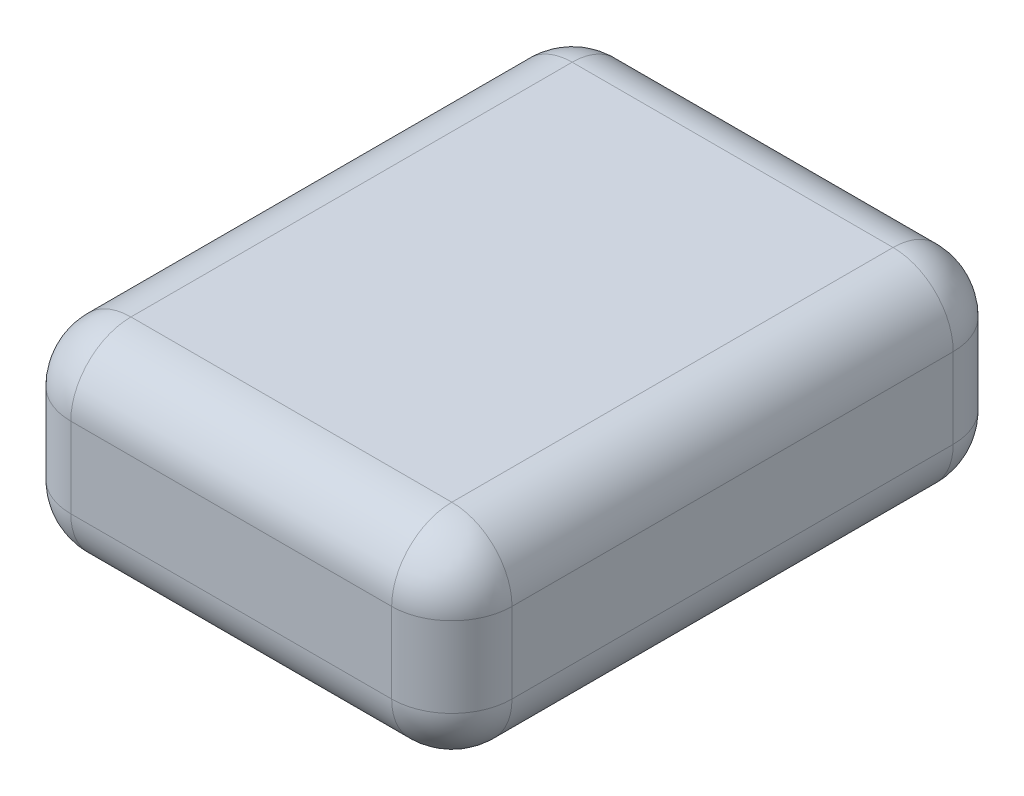
ISO-10303-21;
HEADER;
FILE_DESCRIPTION(('STEP AP214'),'2;1');
FILE_NAME('part.step','',(''),(''),'','','');
FILE_SCHEMA(('AUTOMOTIVE_DESIGN { 1 0 10303 214 1 1 1 1 }'));
ENDSEC;
DATA;
#1=APPLICATION_CONTEXT('core data for automotive mechanical design processes');
#2=APPLICATION_PROTOCOL_DEFINITION('international standard','automotive_design',2000,#1);
#3=PRODUCT_CONTEXT('',#1,'mechanical');
#4=PRODUCT('Part','Part','',(#3));
#5=PRODUCT_RELATED_PRODUCT_CATEGORY('part','',(#4));
#6=PRODUCT_DEFINITION_FORMATION('','',#4);
#7=PRODUCT_DEFINITION_CONTEXT('part definition',#1,'design');
#8=PRODUCT_DEFINITION('design','',#6,#7);
#9=PRODUCT_DEFINITION_SHAPE('','',#8);
#10=(LENGTH_UNIT() NAMED_UNIT(*) SI_UNIT(.MILLI.,.METRE.));
#11=(NAMED_UNIT(*) PLANE_ANGLE_UNIT() SI_UNIT($,.RADIAN.));
#12=(NAMED_UNIT(*) SI_UNIT($,.STERADIAN.) SOLID_ANGLE_UNIT());
#13=UNCERTAINTY_MEASURE_WITH_UNIT(LENGTH_MEASURE(1.E-05),#10,'distance_accuracy_value','');
#14=(GEOMETRIC_REPRESENTATION_CONTEXT(3) GLOBAL_UNCERTAINTY_ASSIGNED_CONTEXT((#13)) GLOBAL_UNIT_ASSIGNED_CONTEXT((#10,
#11,#12)) REPRESENTATION_CONTEXT('',''));
#15=CARTESIAN_POINT('',(0.,0.,0.));
#16=DIRECTION('',(0.,0.,1.));
#17=DIRECTION('',(1.,0.,0.));
#18=AXIS2_PLACEMENT_3D('',#15,#16,#17);
#19=CARTESIAN_POINT('',(11.,10.,-14.));
#20=DIRECTION('',(-1.,0.,0.));
#21=DIRECTION('',(0.,0.,1.));
#22=AXIS2_PLACEMENT_3D('',#19,#20,#21);
#23=PLANE('',#22);
#24=DIRECTION('',(0.,0.,-1.));
#25=VECTOR('',#24,1.);
#26=CARTESIAN_POINT('',(11.,7.,14.));
#27=LINE('',#26,#25);
#28=CARTESIAN_POINT('',(11.,7.,-11.));
#29=VERTEX_POINT('',#28);
#30=CARTESIAN_POINT('',(11.,7.,11.));
#31=VERTEX_POINT('',#30);
#32=EDGE_CURVE('E236',#29,#31,#27,.F.);
#33=ORIENTED_EDGE('',*,*,#32,.T.);
#34=DIRECTION('',(0.,-1.,0.));
#35=VECTOR('',#34,1.);
#36=CARTESIAN_POINT('',(11.,10.,11.));
#37=LINE('',#36,#35);
#38=CARTESIAN_POINT('',(11.,3.,11.));
#39=VERTEX_POINT('',#38);
#40=EDGE_CURVE('E162',#31,#39,#37,.T.);
#41=ORIENTED_EDGE('',*,*,#40,.T.);
#42=DIRECTION('',(0.,0.,-1.));
#43=VECTOR('',#42,1.);
#44=CARTESIAN_POINT('',(11.,3.,-14.));
#45=LINE('',#44,#43);
#46=CARTESIAN_POINT('',(11.,3.,-11.));
#47=VERTEX_POINT('',#46);
#48=EDGE_CURVE('E240',#39,#47,#45,.T.);
#49=ORIENTED_EDGE('',*,*,#48,.T.);
#50=DIRECTION('',(0.,-1.,0.));
#51=VECTOR('',#50,1.);
#52=CARTESIAN_POINT('',(11.,10.,-11.));
#53=LINE('',#52,#51);
#54=EDGE_CURVE('E238',#47,#29,#53,.F.);
#55=ORIENTED_EDGE('',*,*,#54,.T.);
#56=EDGE_LOOP('',(#33,#41,#49,#55));
#57=FACE_BOUND('',#56,.T.);
#58=ADVANCED_FACE('F41',(#57),#23,.F.);
#59=CARTESIAN_POINT('',(-11.,10.,-14.));
#60=DIRECTION('',(0.,0.,1.));
#61=DIRECTION('',(1.,0.,0.));
#62=AXIS2_PLACEMENT_3D('',#59,#60,#61);
#63=PLANE('',#62);
#64=DIRECTION('',(-1.,0.,0.));
#65=VECTOR('',#64,1.);
#66=CARTESIAN_POINT('',(11.,7.,-14.));
#67=LINE('',#66,#65);
#68=CARTESIAN_POINT('',(-8.00000000000001,7.,-14.));
#69=VERTEX_POINT('',#68);
#70=CARTESIAN_POINT('',(7.99999999999999,7.,-14.));
#71=VERTEX_POINT('',#70);
#72=EDGE_CURVE('E243',#69,#71,#67,.F.);
#73=ORIENTED_EDGE('',*,*,#72,.T.);
#74=DIRECTION('',(0.,-1.,0.));
#75=VECTOR('',#74,1.);
#76=CARTESIAN_POINT('',(7.99999999999999,10.,-14.));
#77=LINE('',#76,#75);
#78=CARTESIAN_POINT('',(7.99999999999999,3.,-14.));
#79=VERTEX_POINT('',#78);
#80=EDGE_CURVE('E248',#71,#79,#77,.T.);
#81=ORIENTED_EDGE('',*,*,#80,.T.);
#82=DIRECTION('',(-1.,0.,0.));
#83=VECTOR('',#82,1.);
#84=CARTESIAN_POINT('',(-11.,3.,-14.));
#85=LINE('',#84,#83);
#86=CARTESIAN_POINT('',(-8.00000000000001,3.,-14.));
#87=VERTEX_POINT('',#86);
#88=EDGE_CURVE('E246',#79,#87,#85,.T.);
#89=ORIENTED_EDGE('',*,*,#88,.T.);
#90=DIRECTION('',(0.,-1.,0.));
#91=VECTOR('',#90,1.);
#92=CARTESIAN_POINT('',(-8.00000000000001,10.,-14.));
#93=LINE('',#92,#91);
#94=EDGE_CURVE('E220',#87,#69,#93,.F.);
#95=ORIENTED_EDGE('',*,*,#94,.T.);
#96=EDGE_LOOP('',(#73,#81,#89,#95));
#97=FACE_BOUND('',#96,.T.);
#98=ADVANCED_FACE('F312',(#97),#63,.F.);
#99=CARTESIAN_POINT('',(-11.,10.,-14.));
#100=DIRECTION('',(1.,0.,0.));
#101=DIRECTION('',(0.,0.,-1.));
#102=AXIS2_PLACEMENT_3D('',#99,#100,#101);
#103=PLANE('',#102);
#104=DIRECTION('',(0.,-1.,0.));
#105=VECTOR('',#104,1.);
#106=CARTESIAN_POINT('',(-11.,10.,-11.));
#107=LINE('',#106,#105);
#108=CARTESIAN_POINT('',(-11.,7.,-11.));
#109=VERTEX_POINT('',#108);
#110=CARTESIAN_POINT('',(-11.,3.,-11.));
#111=VERTEX_POINT('',#110);
#112=EDGE_CURVE('E222',#109,#111,#107,.T.);
#113=ORIENTED_EDGE('',*,*,#112,.T.);
#114=DIRECTION('',(0.,0.,1.));
#115=VECTOR('',#114,1.);
#116=CARTESIAN_POINT('',(-11.,3.,-14.));
#117=LINE('',#116,#115);
#118=CARTESIAN_POINT('',(-11.,3.,11.));
#119=VERTEX_POINT('',#118);
#120=EDGE_CURVE('E229',#111,#119,#117,.T.);
#121=ORIENTED_EDGE('',*,*,#120,.T.);
#122=DIRECTION('',(0.,-1.,0.));
#123=VECTOR('',#122,1.);
#124=CARTESIAN_POINT('',(-11.,10.,11.));
#125=LINE('',#124,#123);
#126=CARTESIAN_POINT('',(-11.,7.,11.));
#127=VERTEX_POINT('',#126);
#128=EDGE_CURVE('E225',#119,#127,#125,.F.);
#129=ORIENTED_EDGE('',*,*,#128,.T.);
#130=DIRECTION('',(0.,0.,1.));
#131=VECTOR('',#130,1.);
#132=CARTESIAN_POINT('',(-11.,7.,-14.));
#133=LINE('',#132,#131);
#134=EDGE_CURVE('E226',#127,#109,#133,.F.);
#135=ORIENTED_EDGE('',*,*,#134,.T.);
#136=EDGE_LOOP('',(#113,#121,#129,#135));
#137=FACE_BOUND('',#136,.T.);
#138=ADVANCED_FACE('F298',(#137),#103,.F.);
#139=CARTESIAN_POINT('',(-11.,10.,14.));
#140=DIRECTION('',(0.,0.,-1.));
#141=DIRECTION('',(-1.,0.,0.));
#142=AXIS2_PLACEMENT_3D('',#139,#140,#141);
#143=PLANE('',#142);
#144=DIRECTION('',(0.,-1.,0.));
#145=VECTOR('',#144,1.);
#146=CARTESIAN_POINT('',(-8.,10.,14.));
#147=LINE('',#146,#145);
#148=CARTESIAN_POINT('',(-8.,7.,14.));
#149=VERTEX_POINT('',#148);
#150=CARTESIAN_POINT('',(-8.,3.,14.));
#151=VERTEX_POINT('',#150);
#152=EDGE_CURVE('E140',#149,#151,#147,.T.);
#153=ORIENTED_EDGE('',*,*,#152,.T.);
#154=DIRECTION('',(1.,0.,0.));
#155=VECTOR('',#154,1.);
#156=CARTESIAN_POINT('',(-11.,3.,14.));
#157=LINE('',#156,#155);
#158=CARTESIAN_POINT('',(8.,3.,14.));
#159=VERTEX_POINT('',#158);
#160=EDGE_CURVE('E136',#151,#159,#157,.T.);
#161=ORIENTED_EDGE('',*,*,#160,.T.);
#162=DIRECTION('',(0.,-1.,0.));
#163=VECTOR('',#162,1.);
#164=CARTESIAN_POINT('',(8.,10.,14.));
#165=LINE('',#164,#163);
#166=CARTESIAN_POINT('',(8.,7.,14.));
#167=VERTEX_POINT('',#166);
#168=EDGE_CURVE('E130',#159,#167,#165,.F.);
#169=ORIENTED_EDGE('',*,*,#168,.T.);
#170=DIRECTION('',(1.,0.,0.));
#171=VECTOR('',#170,1.);
#172=CARTESIAN_POINT('',(-11.,7.,14.));
#173=LINE('',#172,#171);
#174=EDGE_CURVE('E133',#167,#149,#173,.F.);
#175=ORIENTED_EDGE('',*,*,#174,.T.);
#176=EDGE_LOOP('',(#153,#161,#169,#175));
#177=FACE_BOUND('',#176,.T.);
#178=ADVANCED_FACE('F132',(#177),#143,.F.);
#179=CARTESIAN_POINT('',(0.,10.,0.));
#180=DIRECTION('',(0.,1.,0.));
#181=DIRECTION('',(0.,0.,1.));
#182=AXIS2_PLACEMENT_3D('',#179,#180,#181);
#183=PLANE('',#182);
#184=DIRECTION('',(0.,0.,-1.));
#185=VECTOR('',#184,1.);
#186=CARTESIAN_POINT('',(7.99999999999999,10.,-14.));
#187=LINE('',#186,#185);
#188=CARTESIAN_POINT('',(8.,10.,11.));
#189=VERTEX_POINT('',#188);
#190=CARTESIAN_POINT('',(7.99999999999999,10.,-11.));
#191=VERTEX_POINT('',#190);
#192=EDGE_CURVE('E251',#189,#191,#187,.T.);
#193=ORIENTED_EDGE('',*,*,#192,.T.);
#194=DIRECTION('',(-1.,0.,0.));
#195=VECTOR('',#194,1.);
#196=CARTESIAN_POINT('',(-11.,10.,-11.));
#197=LINE('',#196,#195);
#198=CARTESIAN_POINT('',(-8.00000000000001,10.,-11.));
#199=VERTEX_POINT('',#198);
#200=EDGE_CURVE('E11',#191,#199,#197,.T.);
#201=ORIENTED_EDGE('',*,*,#200,.T.);
#202=DIRECTION('',(0.,0.,1.));
#203=VECTOR('',#202,1.);
#204=CARTESIAN_POINT('',(-8.,10.,14.));
#205=LINE('',#204,#203);
#206=CARTESIAN_POINT('',(-8.,10.,11.));
#207=VERTEX_POINT('',#206);
#208=EDGE_CURVE('E50',#199,#207,#205,.T.);
#209=ORIENTED_EDGE('',*,*,#208,.T.);
#210=DIRECTION('',(1.,0.,0.));
#211=VECTOR('',#210,1.);
#212=CARTESIAN_POINT('',(11.,10.,11.));
#213=LINE('',#212,#211);
#214=EDGE_CURVE('E253',#207,#189,#213,.T.);
#215=ORIENTED_EDGE('',*,*,#214,.T.);
#216=EDGE_LOOP('',(#193,#201,#209,#215));
#217=FACE_BOUND('',#216,.T.);
#218=ADVANCED_FACE('F373',(#217),#183,.T.);
#219=CARTESIAN_POINT('',(0.,0.,0.));
#220=DIRECTION('',(0.,1.,0.));
#221=DIRECTION('',(0.,0.,1.));
#222=AXIS2_PLACEMENT_3D('',#219,#220,#221);
#223=PLANE('',#222);
#224=DIRECTION('',(0.,0.,-1.));
#225=VECTOR('',#224,1.);
#226=CARTESIAN_POINT('',(7.99999999999999,0.,0.));
#227=LINE('',#226,#225);
#228=CARTESIAN_POINT('',(7.99999999999999,0.,-11.));
#229=VERTEX_POINT('',#228);
#230=CARTESIAN_POINT('',(8.,0.,11.));
#231=VERTEX_POINT('',#230);
#232=EDGE_CURVE('E286',#229,#231,#227,.F.);
#233=ORIENTED_EDGE('',*,*,#232,.T.);
#234=DIRECTION('',(1.,0.,0.));
#235=VECTOR('',#234,1.);
#236=CARTESIAN_POINT('',(0.,0.,11.));
#237=LINE('',#236,#235);
#238=CARTESIAN_POINT('',(-8.,0.,11.));
#239=VERTEX_POINT('',#238);
#240=EDGE_CURVE('E231',#231,#239,#237,.F.);
#241=ORIENTED_EDGE('',*,*,#240,.T.);
#242=DIRECTION('',(0.,0.,1.));
#243=VECTOR('',#242,1.);
#244=CARTESIAN_POINT('',(-8.00000000000001,0.,0.));
#245=LINE('',#244,#243);
#246=CARTESIAN_POINT('',(-8.00000000000001,0.,-11.));
#247=VERTEX_POINT('',#246);
#248=EDGE_CURVE('E276',#239,#247,#245,.F.);
#249=ORIENTED_EDGE('',*,*,#248,.T.);
#250=DIRECTION('',(-1.,0.,0.));
#251=VECTOR('',#250,1.);
#252=CARTESIAN_POINT('',(0.,0.,-11.));
#253=LINE('',#252,#251);
#254=EDGE_CURVE('E281',#247,#229,#253,.F.);
#255=ORIENTED_EDGE('',*,*,#254,.T.);
#256=EDGE_LOOP('',(#233,#241,#249,#255));
#257=FACE_BOUND('',#256,.T.);
#258=ADVANCED_FACE('F284',(#257),#223,.F.);
#259=CARTESIAN_POINT('',(0.,7.,-11.));
#260=DIRECTION('',(1.,0.,0.));
#261=DIRECTION('',(0.,0.,-1.));
#262=AXIS2_PLACEMENT_3D('',#259,#260,#261);
#263=CYLINDRICAL_SURFACE('',#262,3.);
#264=CARTESIAN_POINT('',(-8.00000000000001,7.,-11.));
#265=DIRECTION('',(-1.,0.,0.));
#266=DIRECTION('',(0.,0.,1.));
#267=AXIS2_PLACEMENT_3D('',#264,#265,#266);
#268=CIRCLE('',#267,3.);
#269=EDGE_CURVE('E45',#199,#69,#268,.T.);
#270=ORIENTED_EDGE('',*,*,#269,.F.);
#271=ORIENTED_EDGE('',*,*,#200,.F.);
#272=CARTESIAN_POINT('',(7.99999999999999,7.,-11.));
#273=DIRECTION('',(1.,0.,0.));
#274=DIRECTION('',(0.,0.,-1.));
#275=AXIS2_PLACEMENT_3D('',#272,#273,#274);
#276=CIRCLE('',#275,3.);
#277=EDGE_CURVE('E201',#71,#191,#276,.T.);
#278=ORIENTED_EDGE('',*,*,#277,.F.);
#279=ORIENTED_EDGE('',*,*,#72,.F.);
#280=EDGE_LOOP('',(#270,#271,#278,#279));
#281=FACE_BOUND('',#280,.T.);
#282=ADVANCED_FACE('F43',(#281),#263,.T.);
#283=CARTESIAN_POINT('',(-8.00000000000001,7.,-11.));
#284=DIRECTION('',(0.,0.,-1.));
#285=DIRECTION('',(-1.,0.,0.));
#286=AXIS2_PLACEMENT_3D('',#283,#284,#285);
#287=SPHERICAL_SURFACE('',#286,3.);
#288=CARTESIAN_POINT('',(-8.00000000000001,7.,-11.));
#289=DIRECTION('',(0.,0.,-1.));
#290=DIRECTION('',(-1.,0.,0.));
#291=AXIS2_PLACEMENT_3D('',#288,#289,#290);
#292=CIRCLE('',#291,3.);
#293=EDGE_CURVE('E197',#199,#109,#292,.F.);
#294=ORIENTED_EDGE('',*,*,#293,.F.);
#295=ORIENTED_EDGE('',*,*,#269,.T.);
#296=CARTESIAN_POINT('',(-8.00000000000001,7.,-11.));
#297=DIRECTION('',(0.,1.,0.));
#298=DIRECTION('',(0.,0.,1.));
#299=AXIS2_PLACEMENT_3D('',#296,#297,#298);
#300=CIRCLE('',#299,3.);
#301=EDGE_CURVE('E199',#109,#69,#300,.F.);
#302=ORIENTED_EDGE('',*,*,#301,.F.);
#303=EDGE_LOOP('',(#294,#295,#302));
#304=FACE_BOUND('',#303,.T.);
#305=ADVANCED_FACE('F211',(#304),#287,.T.);
#306=CARTESIAN_POINT('',(7.99999999999999,7.,-11.));
#307=DIRECTION('',(0.,1.,0.));
#308=DIRECTION('',(0.,0.,1.));
#309=AXIS2_PLACEMENT_3D('',#306,#307,#308);
#310=SPHERICAL_SURFACE('',#309,3.);
#311=CARTESIAN_POINT('',(7.99999999999999,7.,-11.));
#312=DIRECTION('',(0.,1.,0.));
#313=DIRECTION('',(0.,0.,1.));
#314=AXIS2_PLACEMENT_3D('',#311,#312,#313);
#315=CIRCLE('',#314,3.);
#316=EDGE_CURVE('E191',#71,#29,#315,.F.);
#317=ORIENTED_EDGE('',*,*,#316,.F.);
#318=ORIENTED_EDGE('',*,*,#277,.T.);
#319=CARTESIAN_POINT('',(7.99999999999999,7.,-11.));
#320=DIRECTION('',(0.,0.,-1.));
#321=DIRECTION('',(-1.,0.,0.));
#322=AXIS2_PLACEMENT_3D('',#319,#320,#321);
#323=CIRCLE('',#322,3.);
#324=EDGE_CURVE('E194',#29,#191,#323,.F.);
#325=ORIENTED_EDGE('',*,*,#324,.F.);
#326=EDGE_LOOP('',(#317,#318,#325));
#327=FACE_BOUND('',#326,.T.);
#328=ADVANCED_FACE('F309',(#327),#310,.T.);
#329=CARTESIAN_POINT('',(-8.00000000000001,10.,-11.));
#330=DIRECTION('',(0.,-1.,0.));
#331=DIRECTION('',(0.,0.,-1.));
#332=AXIS2_PLACEMENT_3D('',#329,#330,#331);
#333=CYLINDRICAL_SURFACE('',#332,3.);
#334=ORIENTED_EDGE('',*,*,#301,.T.);
#335=ORIENTED_EDGE('',*,*,#94,.F.);
#336=CARTESIAN_POINT('',(-8.00000000000001,3.,-11.));
#337=DIRECTION('',(0.,-1.,0.));
#338=DIRECTION('',(0.,0.,-1.));
#339=AXIS2_PLACEMENT_3D('',#336,#337,#338);
#340=CIRCLE('',#339,3.);
#341=EDGE_CURVE('E185',#111,#87,#340,.T.);
#342=ORIENTED_EDGE('',*,*,#341,.F.);
#343=ORIENTED_EDGE('',*,*,#112,.F.);
#344=EDGE_LOOP('',(#334,#335,#342,#343));
#345=FACE_BOUND('',#344,.T.);
#346=ADVANCED_FACE('F218',(#345),#333,.T.);
#347=CARTESIAN_POINT('',(-8.00000000000001,7.,0.));
#348=DIRECTION('',(0.,0.,-1.));
#349=DIRECTION('',(-1.,0.,0.));
#350=AXIS2_PLACEMENT_3D('',#347,#348,#349);
#351=CYLINDRICAL_SURFACE('',#350,3.);
#352=ORIENTED_EDGE('',*,*,#293,.T.);
#353=ORIENTED_EDGE('',*,*,#134,.F.);
#354=CARTESIAN_POINT('',(-8.,7.,11.));
#355=DIRECTION('',(0.,0.,1.));
#356=DIRECTION('',(1.,0.,0.));
#357=AXIS2_PLACEMENT_3D('',#354,#355,#356);
#358=CIRCLE('',#357,3.);
#359=EDGE_CURVE('E182',#207,#127,#358,.T.);
#360=ORIENTED_EDGE('',*,*,#359,.F.);
#361=ORIENTED_EDGE('',*,*,#208,.F.);
#362=EDGE_LOOP('',(#352,#353,#360,#361));
#363=FACE_BOUND('',#362,.T.);
#364=ADVANCED_FACE('F300',(#363),#351,.T.);
#365=CARTESIAN_POINT('',(0.,7.,11.));
#366=DIRECTION('',(-1.,0.,0.));
#367=DIRECTION('',(0.,0.,1.));
#368=AXIS2_PLACEMENT_3D('',#365,#366,#367);
#369=CYLINDRICAL_SURFACE('',#368,3.);
#370=CARTESIAN_POINT('',(8.,7.,11.));
#371=DIRECTION('',(1.,0.,0.));
#372=DIRECTION('',(0.,0.,-1.));
#373=AXIS2_PLACEMENT_3D('',#370,#371,#372);
#374=CIRCLE('',#373,3.);
#375=EDGE_CURVE('E146',#189,#167,#374,.T.);
#376=ORIENTED_EDGE('',*,*,#375,.F.);
#377=ORIENTED_EDGE('',*,*,#214,.F.);
#378=CARTESIAN_POINT('',(-8.,7.,11.));
#379=DIRECTION('',(-1.,0.,0.));
#380=DIRECTION('',(0.,0.,1.));
#381=AXIS2_PLACEMENT_3D('',#378,#379,#380);
#382=CIRCLE('',#381,3.);
#383=EDGE_CURVE('E149',#149,#207,#382,.T.);
#384=ORIENTED_EDGE('',*,*,#383,.F.);
#385=ORIENTED_EDGE('',*,*,#174,.F.);
#386=EDGE_LOOP('',(#376,#377,#384,#385));
#387=FACE_BOUND('',#386,.T.);
#388=ADVANCED_FACE('F145',(#387),#369,.T.);
#389=CARTESIAN_POINT('',(7.99999999999999,7.,0.));
#390=DIRECTION('',(0.,0.,1.));
#391=DIRECTION('',(1.,0.,0.));
#392=AXIS2_PLACEMENT_3D('',#389,#390,#391);
#393=CYLINDRICAL_SURFACE('',#392,3.);
#394=ORIENTED_EDGE('',*,*,#324,.T.);
#395=ORIENTED_EDGE('',*,*,#192,.F.);
#396=CARTESIAN_POINT('',(8.,7.,11.));
#397=DIRECTION('',(0.,0.,1.));
#398=DIRECTION('',(1.,0.,0.));
#399=AXIS2_PLACEMENT_3D('',#396,#397,#398);
#400=CIRCLE('',#399,3.);
#401=EDGE_CURVE('E158',#31,#189,#400,.T.);
#402=ORIENTED_EDGE('',*,*,#401,.F.);
#403=ORIENTED_EDGE('',*,*,#32,.F.);
#404=EDGE_LOOP('',(#394,#395,#402,#403));
#405=FACE_BOUND('',#404,.T.);
#406=ADVANCED_FACE('F307',(#405),#393,.T.);
#407=CARTESIAN_POINT('',(7.99999999999999,10.,-11.));
#408=DIRECTION('',(0.,-1.,0.));
#409=DIRECTION('',(0.,0.,-1.));
#410=AXIS2_PLACEMENT_3D('',#407,#408,#409);
#411=CYLINDRICAL_SURFACE('',#410,3.);
#412=ORIENTED_EDGE('',*,*,#316,.T.);
#413=ORIENTED_EDGE('',*,*,#54,.F.);
#414=CARTESIAN_POINT('',(7.99999999999999,3.,-11.));
#415=DIRECTION('',(0.,-1.,0.));
#416=DIRECTION('',(0.,0.,-1.));
#417=AXIS2_PLACEMENT_3D('',#414,#415,#416);
#418=CIRCLE('',#417,3.);
#419=EDGE_CURVE('E177',#79,#47,#418,.T.);
#420=ORIENTED_EDGE('',*,*,#419,.F.);
#421=ORIENTED_EDGE('',*,*,#80,.F.);
#422=EDGE_LOOP('',(#412,#413,#420,#421));
#423=FACE_BOUND('',#422,.T.);
#424=ADVANCED_FACE('F358',(#423),#411,.T.);
#425=CARTESIAN_POINT('',(-11.,3.,-11.));
#426=DIRECTION('',(-1.,0.,0.));
#427=DIRECTION('',(0.,0.,1.));
#428=AXIS2_PLACEMENT_3D('',#425,#426,#427);
#429=CYLINDRICAL_SURFACE('',#428,3.);
#430=CARTESIAN_POINT('',(-8.00000000000001,3.,-11.));
#431=DIRECTION('',(-1.,0.,0.));
#432=DIRECTION('',(0.,0.,1.));
#433=AXIS2_PLACEMENT_3D('',#430,#431,#432);
#434=CIRCLE('',#433,3.);
#435=EDGE_CURVE('E188',#87,#247,#434,.T.);
#436=ORIENTED_EDGE('',*,*,#435,.F.);
#437=ORIENTED_EDGE('',*,*,#88,.F.);
#438=CARTESIAN_POINT('',(7.99999999999999,3.,-11.));
#439=DIRECTION('',(1.,0.,0.));
#440=DIRECTION('',(0.,0.,-1.));
#441=AXIS2_PLACEMENT_3D('',#438,#439,#440);
#442=CIRCLE('',#441,3.);
#443=EDGE_CURVE('E175',#229,#79,#442,.T.);
#444=ORIENTED_EDGE('',*,*,#443,.F.);
#445=ORIENTED_EDGE('',*,*,#254,.F.);
#446=EDGE_LOOP('',(#436,#437,#444,#445));
#447=FACE_BOUND('',#446,.T.);
#448=ADVANCED_FACE('F354',(#447),#429,.T.);
#449=CARTESIAN_POINT('',(-8.00000000000001,3.,-11.));
#450=DIRECTION('',(0.,0.,-1.));
#451=DIRECTION('',(-1.,0.,0.));
#452=AXIS2_PLACEMENT_3D('',#449,#450,#451);
#453=SPHERICAL_SURFACE('',#452,3.);
#454=ORIENTED_EDGE('',*,*,#341,.T.);
#455=ORIENTED_EDGE('',*,*,#435,.T.);
#456=CARTESIAN_POINT('',(-8.00000000000001,3.,-11.));
#457=DIRECTION('',(0.,0.,-1.));
#458=DIRECTION('',(-1.,0.,0.));
#459=AXIS2_PLACEMENT_3D('',#456,#457,#458);
#460=CIRCLE('',#459,3.);
#461=EDGE_CURVE('E166',#111,#247,#460,.F.);
#462=ORIENTED_EDGE('',*,*,#461,.F.);
#463=EDGE_LOOP('',(#454,#455,#462));
#464=FACE_BOUND('',#463,.T.);
#465=ADVANCED_FACE('F350',(#464),#453,.T.);
#466=CARTESIAN_POINT('',(-8.,7.,11.));
#467=DIRECTION('',(0.,1.,0.));
#468=DIRECTION('',(0.,0.,1.));
#469=AXIS2_PLACEMENT_3D('',#466,#467,#468);
#470=SPHERICAL_SURFACE('',#469,3.);
#471=ORIENTED_EDGE('',*,*,#383,.T.);
#472=ORIENTED_EDGE('',*,*,#359,.T.);
#473=CARTESIAN_POINT('',(-8.,7.,11.));
#474=DIRECTION('',(0.,1.,0.));
#475=DIRECTION('',(0.,0.,1.));
#476=AXIS2_PLACEMENT_3D('',#473,#474,#475);
#477=CIRCLE('',#476,3.);
#478=EDGE_CURVE('E163',#149,#127,#477,.F.);
#479=ORIENTED_EDGE('',*,*,#478,.F.);
#480=EDGE_LOOP('',(#471,#472,#479));
#481=FACE_BOUND('',#480,.T.);
#482=ADVANCED_FACE('F347',(#481),#470,.T.);
#483=CARTESIAN_POINT('',(8.,7.,11.));
#484=DIRECTION('',(0.,1.,0.));
#485=DIRECTION('',(0.,0.,1.));
#486=AXIS2_PLACEMENT_3D('',#483,#484,#485);
#487=SPHERICAL_SURFACE('',#486,3.);
#488=ORIENTED_EDGE('',*,*,#401,.T.);
#489=ORIENTED_EDGE('',*,*,#375,.T.);
#490=CARTESIAN_POINT('',(8.,7.,11.));
#491=DIRECTION('',(0.,1.,0.));
#492=DIRECTION('',(0.,0.,1.));
#493=AXIS2_PLACEMENT_3D('',#490,#491,#492);
#494=CIRCLE('',#493,3.);
#495=EDGE_CURVE('E155',#31,#167,#494,.F.);
#496=ORIENTED_EDGE('',*,*,#495,.F.);
#497=EDGE_LOOP('',(#488,#489,#496));
#498=FACE_BOUND('',#497,.T.);
#499=ADVANCED_FACE('F154',(#498),#487,.T.);
#500=CARTESIAN_POINT('',(7.99999999999999,3.,-11.));
#501=DIRECTION('',(0.,0.,-1.));
#502=DIRECTION('',(-1.,0.,0.));
#503=AXIS2_PLACEMENT_3D('',#500,#501,#502);
#504=SPHERICAL_SURFACE('',#503,3.);
#505=ORIENTED_EDGE('',*,*,#443,.T.);
#506=ORIENTED_EDGE('',*,*,#419,.T.);
#507=CARTESIAN_POINT('',(7.99999999999999,3.,-11.));
#508=DIRECTION('',(0.,0.,-1.));
#509=DIRECTION('',(-1.,0.,0.));
#510=AXIS2_PLACEMENT_3D('',#507,#508,#509);
#511=CIRCLE('',#510,3.);
#512=EDGE_CURVE('E164',#229,#47,#511,.F.);
#513=ORIENTED_EDGE('',*,*,#512,.F.);
#514=EDGE_LOOP('',(#505,#506,#513));
#515=FACE_BOUND('',#514,.T.);
#516=ADVANCED_FACE('F341',(#515),#504,.T.);
#517=CARTESIAN_POINT('',(-8.00000000000001,3.,-14.));
#518=DIRECTION('',(0.,0.,1.));
#519=DIRECTION('',(1.,0.,0.));
#520=AXIS2_PLACEMENT_3D('',#517,#518,#519);
#521=CYLINDRICAL_SURFACE('',#520,3.);
#522=ORIENTED_EDGE('',*,*,#461,.T.);
#523=ORIENTED_EDGE('',*,*,#248,.F.);
#524=CARTESIAN_POINT('',(-8.,3.,11.));
#525=DIRECTION('',(0.,0.,1.));
#526=DIRECTION('',(1.,0.,0.));
#527=AXIS2_PLACEMENT_3D('',#524,#525,#526);
#528=CIRCLE('',#527,3.);
#529=EDGE_CURVE('E169',#119,#239,#528,.T.);
#530=ORIENTED_EDGE('',*,*,#529,.F.);
#531=ORIENTED_EDGE('',*,*,#120,.F.);
#532=EDGE_LOOP('',(#522,#523,#530,#531));
#533=FACE_BOUND('',#532,.T.);
#534=ADVANCED_FACE('F278',(#533),#521,.T.);
#535=CARTESIAN_POINT('',(-8.,10.,11.));
#536=DIRECTION('',(0.,-1.,0.));
#537=DIRECTION('',(0.,0.,-1.));
#538=AXIS2_PLACEMENT_3D('',#535,#536,#537);
#539=CYLINDRICAL_SURFACE('',#538,3.);
#540=ORIENTED_EDGE('',*,*,#478,.T.);
#541=ORIENTED_EDGE('',*,*,#128,.F.);
#542=CARTESIAN_POINT('',(-8.,3.,11.));
#543=DIRECTION('',(0.,-1.,0.));
#544=DIRECTION('',(0.,0.,-1.));
#545=AXIS2_PLACEMENT_3D('',#542,#543,#544);
#546=CIRCLE('',#545,3.);
#547=EDGE_CURVE('E265',#151,#119,#546,.T.);
#548=ORIENTED_EDGE('',*,*,#547,.F.);
#549=ORIENTED_EDGE('',*,*,#152,.F.);
#550=EDGE_LOOP('',(#540,#541,#548,#549));
#551=FACE_BOUND('',#550,.T.);
#552=ADVANCED_FACE('F297',(#551),#539,.T.);
#553=CARTESIAN_POINT('',(8.,10.,11.));
#554=DIRECTION('',(0.,-1.,0.));
#555=DIRECTION('',(0.,0.,-1.));
#556=AXIS2_PLACEMENT_3D('',#553,#554,#555);
#557=CYLINDRICAL_SURFACE('',#556,3.);
#558=ORIENTED_EDGE('',*,*,#495,.T.);
#559=ORIENTED_EDGE('',*,*,#168,.F.);
#560=CARTESIAN_POINT('',(8.,3.,11.));
#561=DIRECTION('',(0.,-1.,0.));
#562=DIRECTION('',(0.,0.,-1.));
#563=AXIS2_PLACEMENT_3D('',#560,#561,#562);
#564=CIRCLE('',#563,3.);
#565=EDGE_CURVE('E262',#39,#159,#564,.T.);
#566=ORIENTED_EDGE('',*,*,#565,.F.);
#567=ORIENTED_EDGE('',*,*,#40,.F.);
#568=EDGE_LOOP('',(#558,#559,#566,#567));
#569=FACE_BOUND('',#568,.T.);
#570=ADVANCED_FACE('F160',(#569),#557,.T.);
#571=CARTESIAN_POINT('',(7.99999999999999,3.,-14.));
#572=DIRECTION('',(0.,0.,-1.));
#573=DIRECTION('',(-1.,0.,0.));
#574=AXIS2_PLACEMENT_3D('',#571,#572,#573);
#575=CYLINDRICAL_SURFACE('',#574,3.);
#576=ORIENTED_EDGE('',*,*,#512,.T.);
#577=ORIENTED_EDGE('',*,*,#48,.F.);
#578=CARTESIAN_POINT('',(8.,3.,11.));
#579=DIRECTION('',(0.,0.,1.));
#580=DIRECTION('',(1.,0.,0.));
#581=AXIS2_PLACEMENT_3D('',#578,#579,#580);
#582=CIRCLE('',#581,3.);
#583=EDGE_CURVE('E260',#231,#39,#582,.T.);
#584=ORIENTED_EDGE('',*,*,#583,.F.);
#585=ORIENTED_EDGE('',*,*,#232,.F.);
#586=EDGE_LOOP('',(#576,#577,#584,#585));
#587=FACE_BOUND('',#586,.T.);
#588=ADVANCED_FACE('F331',(#587),#575,.T.);
#589=CARTESIAN_POINT('',(-8.,3.,11.));
#590=DIRECTION('',(-1.,0.,0.));
#591=DIRECTION('',(0.,0.,1.));
#592=AXIS2_PLACEMENT_3D('',#589,#590,#591);
#593=SPHERICAL_SURFACE('',#592,3.);
#594=ORIENTED_EDGE('',*,*,#547,.T.);
#595=ORIENTED_EDGE('',*,*,#529,.T.);
#596=CARTESIAN_POINT('',(-8.,3.,11.));
#597=DIRECTION('',(-1.,0.,0.));
#598=DIRECTION('',(0.,0.,1.));
#599=AXIS2_PLACEMENT_3D('',#596,#597,#598);
#600=CIRCLE('',#599,3.);
#601=EDGE_CURVE('E258',#151,#239,#600,.F.);
#602=ORIENTED_EDGE('',*,*,#601,.F.);
#603=EDGE_LOOP('',(#594,#595,#602));
#604=FACE_BOUND('',#603,.T.);
#605=ADVANCED_FACE('F272',(#604),#593,.T.);
#606=CARTESIAN_POINT('',(8.,3.,11.));
#607=DIRECTION('',(1.,0.,0.));
#608=DIRECTION('',(0.,0.,-1.));
#609=AXIS2_PLACEMENT_3D('',#606,#607,#608);
#610=SPHERICAL_SURFACE('',#609,3.);
#611=ORIENTED_EDGE('',*,*,#583,.T.);
#612=ORIENTED_EDGE('',*,*,#565,.T.);
#613=CARTESIAN_POINT('',(8.,3.,11.));
#614=DIRECTION('',(1.,0.,0.));
#615=DIRECTION('',(0.,0.,-1.));
#616=AXIS2_PLACEMENT_3D('',#613,#614,#615);
#617=CIRCLE('',#616,3.);
#618=EDGE_CURVE('E256',#231,#159,#617,.F.);
#619=ORIENTED_EDGE('',*,*,#618,.F.);
#620=EDGE_LOOP('',(#611,#612,#619));
#621=FACE_BOUND('',#620,.T.);
#622=ADVANCED_FACE('F325',(#621),#610,.T.);
#623=CARTESIAN_POINT('',(-11.,3.,11.));
#624=DIRECTION('',(1.,0.,0.));
#625=DIRECTION('',(0.,0.,-1.));
#626=AXIS2_PLACEMENT_3D('',#623,#624,#625);
#627=CYLINDRICAL_SURFACE('',#626,3.);
#628=ORIENTED_EDGE('',*,*,#601,.T.);
#629=ORIENTED_EDGE('',*,*,#240,.F.);
#630=ORIENTED_EDGE('',*,*,#618,.T.);
#631=ORIENTED_EDGE('',*,*,#160,.F.);
#632=EDGE_LOOP('',(#628,#629,#630,#631));
#633=FACE_BOUND('',#632,.T.);
#634=ADVANCED_FACE('F322',(#633),#627,.T.);
#635=CLOSED_SHELL('',(#58,#98,#138,#178,#218,#258,#282,#305,#328,#346,#364,#388,#406,#424,#448,
#465,#482,#499,#516,#534,#552,#570,#588,#605,#622,#634));
#636=MANIFOLD_SOLID_BREP('B2',#635);
#637=ADVANCED_BREP_SHAPE_REPRESENTATION('',(#18,#636),#14);
#638=SHAPE_DEFINITION_REPRESENTATION(#9,#637);
ENDSEC;
END-ISO-10303-21;
